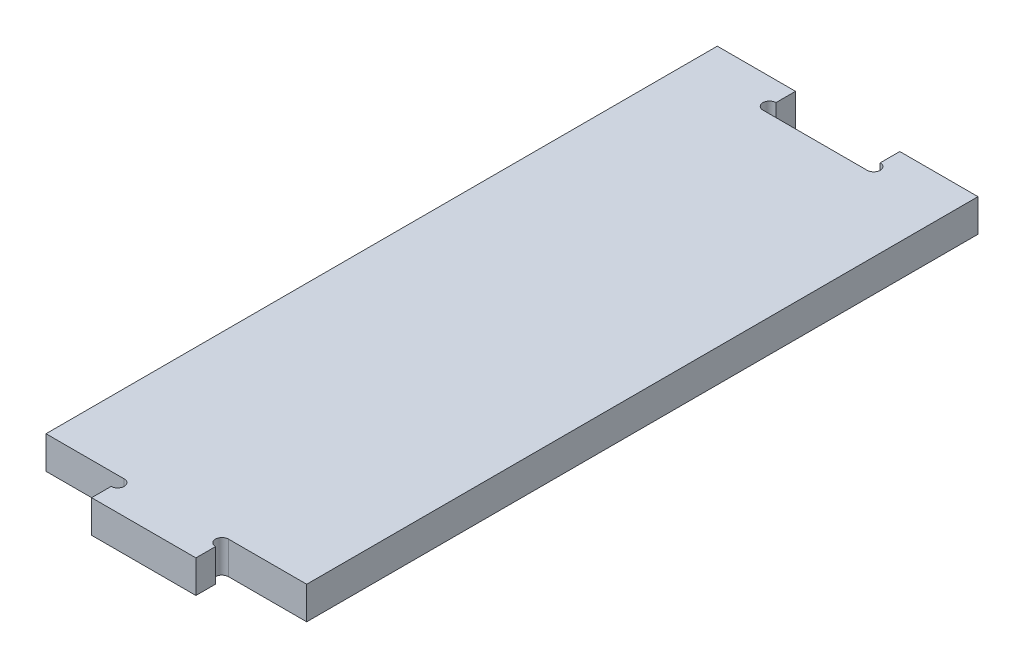
ISO-10303-21;
HEADER;
FILE_DESCRIPTION(('STEP AP214'),'2;1');
FILE_NAME('part.step','',(''),(''),'','','');
FILE_SCHEMA(('AUTOMOTIVE_DESIGN { 1 0 10303 214 1 1 1 1 }'));
ENDSEC;
DATA;
#1=APPLICATION_CONTEXT('core data for automotive mechanical design processes');
#2=APPLICATION_PROTOCOL_DEFINITION('international standard','automotive_design',2000,#1);
#3=PRODUCT_CONTEXT('',#1,'mechanical');
#4=PRODUCT('Part','Part','',(#3));
#5=PRODUCT_RELATED_PRODUCT_CATEGORY('part','',(#4));
#6=PRODUCT_DEFINITION_FORMATION('','',#4);
#7=PRODUCT_DEFINITION_CONTEXT('part definition',#1,'design');
#8=PRODUCT_DEFINITION('design','',#6,#7);
#9=PRODUCT_DEFINITION_SHAPE('','',#8);
#10=(LENGTH_UNIT() NAMED_UNIT(*) SI_UNIT(.MILLI.,.METRE.));
#11=(NAMED_UNIT(*) PLANE_ANGLE_UNIT() SI_UNIT($,.RADIAN.));
#12=(NAMED_UNIT(*) SI_UNIT($,.STERADIAN.) SOLID_ANGLE_UNIT());
#13=UNCERTAINTY_MEASURE_WITH_UNIT(LENGTH_MEASURE(1.E-05),#10,'distance_accuracy_value','');
#14=(GEOMETRIC_REPRESENTATION_CONTEXT(3) GLOBAL_UNCERTAINTY_ASSIGNED_CONTEXT((#13)) GLOBAL_UNIT_ASSIGNED_CONTEXT((#10,
#11,#12)) REPRESENTATION_CONTEXT('',''));
#15=CARTESIAN_POINT('',(0.,0.,0.));
#16=DIRECTION('',(0.,0.,1.));
#17=DIRECTION('',(1.,0.,0.));
#18=AXIS2_PLACEMENT_3D('',#15,#16,#17);
#19=CARTESIAN_POINT('',(0.,5.,0.));
#20=DIRECTION('',(0.,0.,-1.));
#21=DIRECTION('',(-1.,0.,0.));
#22=AXIS2_PLACEMENT_3D('',#19,#20,#21);
#23=PLANE('',#22);
#24=DIRECTION('',(0.,1.,0.));
#25=VECTOR('',#24,1.);
#26=CARTESIAN_POINT('',(28.,0.,0.));
#27=LINE('',#26,#25);
#28=CARTESIAN_POINT('',(28.,0.,0.));
#29=VERTEX_POINT('',#28);
#30=CARTESIAN_POINT('',(28.,5.,0.));
#31=VERTEX_POINT('',#30);
#32=EDGE_CURVE('E245',#29,#31,#27,.T.);
#33=ORIENTED_EDGE('',*,*,#32,.F.);
#34=DIRECTION('',(1.,0.,0.));
#35=VECTOR('',#34,1.);
#36=CARTESIAN_POINT('',(0.,0.,0.));
#37=LINE('',#36,#35);
#38=CARTESIAN_POINT('',(40.,0.,0.));
#39=VERTEX_POINT('',#38);
#40=EDGE_CURVE('E203',#29,#39,#37,.T.);
#41=ORIENTED_EDGE('',*,*,#40,.T.);
#42=DIRECTION('',(0.,-1.,0.));
#43=VECTOR('',#42,1.);
#44=CARTESIAN_POINT('',(40.,5.,0.));
#45=LINE('',#44,#43);
#46=CARTESIAN_POINT('',(40.,5.,0.));
#47=VERTEX_POINT('',#46);
#48=EDGE_CURVE('E224',#47,#39,#45,.T.);
#49=ORIENTED_EDGE('',*,*,#48,.F.);
#50=DIRECTION('',(1.,0.,0.));
#51=VECTOR('',#50,1.);
#52=CARTESIAN_POINT('',(0.,5.,0.));
#53=LINE('',#52,#51);
#54=EDGE_CURVE('E190',#31,#47,#53,.T.);
#55=ORIENTED_EDGE('',*,*,#54,.F.);
#56=EDGE_LOOP('',(#33,#41,#49,#55));
#57=FACE_BOUND('',#56,.T.);
#58=ADVANCED_FACE('F35',(#57),#23,.F.);
#59=CARTESIAN_POINT('',(0.,5.,-103.));
#60=DIRECTION('',(0.,0.,1.));
#61=DIRECTION('',(1.,0.,0.));
#62=AXIS2_PLACEMENT_3D('',#59,#60,#61);
#63=PLANE('',#62);
#64=DIRECTION('',(-1.,0.,0.));
#65=VECTOR('',#64,1.);
#66=CARTESIAN_POINT('',(0.,5.,-103.));
#67=LINE('',#66,#65);
#68=CARTESIAN_POINT('',(12.,5.,-103.));
#69=VERTEX_POINT('',#68);
#70=CARTESIAN_POINT('',(0.,5.,-103.));
#71=VERTEX_POINT('',#70);
#72=EDGE_CURVE('E328',#69,#71,#67,.T.);
#73=ORIENTED_EDGE('',*,*,#72,.F.);
#74=DIRECTION('',(0.,1.,0.));
#75=VECTOR('',#74,1.);
#76=CARTESIAN_POINT('',(12.,0.,-103.));
#77=LINE('',#76,#75);
#78=CARTESIAN_POINT('',(12.,0.,-103.));
#79=VERTEX_POINT('',#78);
#80=EDGE_CURVE('E180',#79,#69,#77,.T.);
#81=ORIENTED_EDGE('',*,*,#80,.F.);
#82=DIRECTION('',(-1.,0.,0.));
#83=VECTOR('',#82,1.);
#84=CARTESIAN_POINT('',(0.,0.,-103.));
#85=LINE('',#84,#83);
#86=CARTESIAN_POINT('',(0.,0.,-103.));
#87=VERTEX_POINT('',#86);
#88=EDGE_CURVE('E214',#79,#87,#85,.T.);
#89=ORIENTED_EDGE('',*,*,#88,.T.);
#90=DIRECTION('',(0.,-1.,0.));
#91=VECTOR('',#90,1.);
#92=CARTESIAN_POINT('',(0.,5.,-103.));
#93=LINE('',#92,#91);
#94=EDGE_CURVE('E217',#71,#87,#93,.T.);
#95=ORIENTED_EDGE('',*,*,#94,.F.);
#96=EDGE_LOOP('',(#73,#81,#89,#95));
#97=FACE_BOUND('',#96,.T.);
#98=ADVANCED_FACE('F335',(#97),#63,.F.);
#99=CARTESIAN_POINT('',(0.,5.,0.));
#100=DIRECTION('',(1.,0.,0.));
#101=DIRECTION('',(0.,0.,-1.));
#102=AXIS2_PLACEMENT_3D('',#99,#100,#101);
#103=PLANE('',#102);
#104=DIRECTION('',(0.,0.,1.));
#105=VECTOR('',#104,1.);
#106=CARTESIAN_POINT('',(0.,0.,0.));
#107=LINE('',#106,#105);
#108=CARTESIAN_POINT('',(0.,0.,0.));
#109=VERTEX_POINT('',#108);
#110=EDGE_CURVE('E182',#87,#109,#107,.T.);
#111=ORIENTED_EDGE('',*,*,#110,.T.);
#112=DIRECTION('',(0.,-1.,0.));
#113=VECTOR('',#112,1.);
#114=CARTESIAN_POINT('',(0.,5.,0.));
#115=LINE('',#114,#113);
#116=CARTESIAN_POINT('',(0.,5.,0.));
#117=VERTEX_POINT('',#116);
#118=EDGE_CURVE('E226',#117,#109,#115,.T.);
#119=ORIENTED_EDGE('',*,*,#118,.F.);
#120=DIRECTION('',(0.,0.,1.));
#121=VECTOR('',#120,1.);
#122=CARTESIAN_POINT('',(0.,5.,0.));
#123=LINE('',#122,#121);
#124=EDGE_CURVE('E187',#71,#117,#123,.T.);
#125=ORIENTED_EDGE('',*,*,#124,.F.);
#126=ORIENTED_EDGE('',*,*,#94,.T.);
#127=EDGE_LOOP('',(#111,#119,#125,#126));
#128=FACE_BOUND('',#127,.T.);
#129=ADVANCED_FACE('F37',(#128),#103,.F.);
#130=CARTESIAN_POINT('',(12.,0.,0.));
#131=VERTEX_POINT('',#130);
#132=EDGE_CURVE('E206',#109,#131,#37,.T.);
#133=ORIENTED_EDGE('',*,*,#132,.T.);
#134=DIRECTION('',(0.,1.,0.));
#135=VECTOR('',#134,1.);
#136=CARTESIAN_POINT('',(12.,0.,0.));
#137=LINE('',#136,#135);
#138=CARTESIAN_POINT('',(12.,5.,0.));
#139=VERTEX_POINT('',#138);
#140=EDGE_CURVE('E176',#131,#139,#137,.T.);
#141=ORIENTED_EDGE('',*,*,#140,.T.);
#142=EDGE_CURVE('E200',#117,#139,#53,.T.);
#143=ORIENTED_EDGE('',*,*,#142,.F.);
#144=ORIENTED_EDGE('',*,*,#118,.T.);
#145=EDGE_LOOP('',(#133,#141,#143,#144));
#146=FACE_BOUND('',#145,.T.);
#147=ADVANCED_FACE('F324',(#146),#23,.F.);
#148=CARTESIAN_POINT('',(40.,5.,0.));
#149=DIRECTION('',(-1.,0.,0.));
#150=DIRECTION('',(0.,0.,1.));
#151=AXIS2_PLACEMENT_3D('',#148,#149,#150);
#152=PLANE('',#151);
#153=DIRECTION('',(0.,0.,-1.));
#154=VECTOR('',#153,1.);
#155=CARTESIAN_POINT('',(40.,0.,0.));
#156=LINE('',#155,#154);
#157=CARTESIAN_POINT('',(40.,0.,-103.));
#158=VERTEX_POINT('',#157);
#159=EDGE_CURVE('E211',#39,#158,#156,.T.);
#160=ORIENTED_EDGE('',*,*,#159,.T.);
#161=DIRECTION('',(0.,-1.,0.));
#162=VECTOR('',#161,1.);
#163=CARTESIAN_POINT('',(40.,5.,-103.));
#164=LINE('',#163,#162);
#165=CARTESIAN_POINT('',(40.,5.,-103.));
#166=VERTEX_POINT('',#165);
#167=EDGE_CURVE('E220',#166,#158,#164,.T.);
#168=ORIENTED_EDGE('',*,*,#167,.F.);
#169=DIRECTION('',(0.,0.,-1.));
#170=VECTOR('',#169,1.);
#171=CARTESIAN_POINT('',(40.,5.,0.));
#172=LINE('',#171,#170);
#173=EDGE_CURVE('E194',#47,#166,#172,.T.);
#174=ORIENTED_EDGE('',*,*,#173,.F.);
#175=ORIENTED_EDGE('',*,*,#48,.T.);
#176=EDGE_LOOP('',(#160,#168,#174,#175));
#177=FACE_BOUND('',#176,.T.);
#178=ADVANCED_FACE('F276',(#177),#152,.F.);
#179=CARTESIAN_POINT('',(28.,0.,-103.));
#180=VERTEX_POINT('',#179);
#181=EDGE_CURVE('E191',#158,#180,#85,.T.);
#182=ORIENTED_EDGE('',*,*,#181,.T.);
#183=DIRECTION('',(0.,1.,0.));
#184=VECTOR('',#183,1.);
#185=CARTESIAN_POINT('',(28.,0.,-103.));
#186=LINE('',#185,#184);
#187=CARTESIAN_POINT('',(28.,5.,-103.));
#188=VERTEX_POINT('',#187);
#189=EDGE_CURVE('E157',#180,#188,#186,.T.);
#190=ORIENTED_EDGE('',*,*,#189,.T.);
#191=EDGE_CURVE('E221',#166,#188,#67,.T.);
#192=ORIENTED_EDGE('',*,*,#191,.F.);
#193=ORIENTED_EDGE('',*,*,#167,.T.);
#194=EDGE_LOOP('',(#182,#190,#192,#193));
#195=FACE_BOUND('',#194,.T.);
#196=ADVANCED_FACE('F272',(#195),#63,.F.);
#197=CARTESIAN_POINT('',(0.,5.,0.));
#198=DIRECTION('',(0.,-1.,0.));
#199=DIRECTION('',(0.,0.,-1.));
#200=AXIS2_PLACEMENT_3D('',#197,#198,#199);
#201=PLANE('',#200);
#202=DIRECTION('',(0.,0.,-1.));
#203=VECTOR('',#202,1.);
#204=CARTESIAN_POINT('',(28.,5.,-103.));
#205=LINE('',#204,#203);
#206=CARTESIAN_POINT('',(28.,5.,-100.));
#207=VERTEX_POINT('',#206);
#208=EDGE_CURVE('E167',#207,#188,#205,.T.);
#209=ORIENTED_EDGE('',*,*,#208,.F.);
#210=CARTESIAN_POINT('',(28.,5.,-99.));
#211=DIRECTION('',(0.,1.,0.));
#212=DIRECTION('',(0.,0.,1.));
#213=AXIS2_PLACEMENT_3D('',#210,#211,#212);
#214=CIRCLE('',#213,1.);
#215=CARTESIAN_POINT('',(28.,5.,-98.));
#216=VERTEX_POINT('',#215);
#217=EDGE_CURVE('E149',#216,#207,#214,.T.);
#218=ORIENTED_EDGE('',*,*,#217,.F.);
#219=DIRECTION('',(1.,0.,0.));
#220=VECTOR('',#219,1.);
#221=CARTESIAN_POINT('',(12.,5.,-98.));
#222=LINE('',#221,#220);
#223=CARTESIAN_POINT('',(12.,5.,-98.));
#224=VERTEX_POINT('',#223);
#225=EDGE_CURVE('E165',#224,#216,#222,.T.);
#226=ORIENTED_EDGE('',*,*,#225,.F.);
#227=CARTESIAN_POINT('',(12.,5.,-99.));
#228=DIRECTION('',(0.,1.,0.));
#229=DIRECTION('',(0.,0.,1.));
#230=AXIS2_PLACEMENT_3D('',#227,#228,#229);
#231=CIRCLE('',#230,1.);
#232=CARTESIAN_POINT('',(12.,5.,-100.));
#233=VERTEX_POINT('',#232);
#234=EDGE_CURVE('E338',#233,#224,#231,.T.);
#235=ORIENTED_EDGE('',*,*,#234,.F.);
#236=DIRECTION('',(0.,0.,1.));
#237=VECTOR('',#236,1.);
#238=CARTESIAN_POINT('',(12.,5.,-103.));
#239=LINE('',#238,#237);
#240=EDGE_CURVE('E171',#69,#233,#239,.T.);
#241=ORIENTED_EDGE('',*,*,#240,.F.);
#242=ORIENTED_EDGE('',*,*,#72,.T.);
#243=ORIENTED_EDGE('',*,*,#124,.T.);
#244=ORIENTED_EDGE('',*,*,#142,.T.);
#245=CARTESIAN_POINT('',(12.,5.,1.));
#246=DIRECTION('',(0.,1.,0.));
#247=DIRECTION('',(0.,0.,1.));
#248=AXIS2_PLACEMENT_3D('',#245,#246,#247);
#249=CIRCLE('',#248,1.);
#250=CARTESIAN_POINT('',(12.,5.,2.));
#251=VERTEX_POINT('',#250);
#252=EDGE_CURVE('E57',#251,#139,#249,.T.);
#253=ORIENTED_EDGE('',*,*,#252,.F.);
#254=DIRECTION('',(0.,0.,1.));
#255=VECTOR('',#254,1.);
#256=CARTESIAN_POINT('',(12.,5.,0.));
#257=LINE('',#256,#255);
#258=CARTESIAN_POINT('',(12.,5.,5.));
#259=VERTEX_POINT('',#258);
#260=EDGE_CURVE('E239',#251,#259,#257,.T.);
#261=ORIENTED_EDGE('',*,*,#260,.T.);
#262=DIRECTION('',(1.,0.,0.));
#263=VECTOR('',#262,1.);
#264=CARTESIAN_POINT('',(12.,5.,5.));
#265=LINE('',#264,#263);
#266=CARTESIAN_POINT('',(28.,5.,5.));
#267=VERTEX_POINT('',#266);
#268=EDGE_CURVE('E309',#259,#267,#265,.T.);
#269=ORIENTED_EDGE('',*,*,#268,.T.);
#270=DIRECTION('',(0.,0.,-1.));
#271=VECTOR('',#270,1.);
#272=CARTESIAN_POINT('',(28.,5.,0.));
#273=LINE('',#272,#271);
#274=CARTESIAN_POINT('',(28.,5.,2.));
#275=VERTEX_POINT('',#274);
#276=EDGE_CURVE('E238',#267,#275,#273,.T.);
#277=ORIENTED_EDGE('',*,*,#276,.T.);
#278=CARTESIAN_POINT('',(28.,5.,1.));
#279=DIRECTION('',(0.,1.,0.));
#280=DIRECTION('',(0.,0.,1.));
#281=AXIS2_PLACEMENT_3D('',#278,#279,#280);
#282=CIRCLE('',#281,1.);
#283=EDGE_CURVE('E49',#31,#275,#282,.T.);
#284=ORIENTED_EDGE('',*,*,#283,.F.);
#285=ORIENTED_EDGE('',*,*,#54,.T.);
#286=ORIENTED_EDGE('',*,*,#173,.T.);
#287=ORIENTED_EDGE('',*,*,#191,.T.);
#288=EDGE_LOOP('',(#209,#218,#226,#235,#241,#242,#243,#244,#253,#261,#269,#277,#284,#285,#286,#287));
#289=FACE_BOUND('',#288,.T.);
#290=ADVANCED_FACE('F163',(#289),#201,.F.);
#291=CARTESIAN_POINT('',(0.,0.,0.));
#292=DIRECTION('',(0.,-1.,0.));
#293=DIRECTION('',(0.,0.,-1.));
#294=AXIS2_PLACEMENT_3D('',#291,#292,#293);
#295=PLANE('',#294);
#296=CARTESIAN_POINT('',(28.,0.,-99.));
#297=DIRECTION('',(0.,-1.,0.));
#298=DIRECTION('',(0.,0.,-1.));
#299=AXIS2_PLACEMENT_3D('',#296,#297,#298);
#300=CIRCLE('',#299,1.);
#301=CARTESIAN_POINT('',(28.,0.,-100.));
#302=VERTEX_POINT('',#301);
#303=CARTESIAN_POINT('',(28.,0.,-98.));
#304=VERTEX_POINT('',#303);
#305=EDGE_CURVE('E152',#302,#304,#300,.T.);
#306=ORIENTED_EDGE('',*,*,#305,.F.);
#307=DIRECTION('',(0.,0.,-1.));
#308=VECTOR('',#307,1.);
#309=CARTESIAN_POINT('',(28.,0.,-103.));
#310=LINE('',#309,#308);
#311=EDGE_CURVE('E186',#302,#180,#310,.T.);
#312=ORIENTED_EDGE('',*,*,#311,.T.);
#313=ORIENTED_EDGE('',*,*,#181,.F.);
#314=ORIENTED_EDGE('',*,*,#159,.F.);
#315=ORIENTED_EDGE('',*,*,#40,.F.);
#316=CARTESIAN_POINT('',(28.,0.,1.));
#317=DIRECTION('',(0.,-1.,0.));
#318=DIRECTION('',(0.,0.,-1.));
#319=AXIS2_PLACEMENT_3D('',#316,#317,#318);
#320=CIRCLE('',#319,1.);
#321=CARTESIAN_POINT('',(28.,0.,2.));
#322=VERTEX_POINT('',#321);
#323=EDGE_CURVE('E281',#322,#29,#320,.T.);
#324=ORIENTED_EDGE('',*,*,#323,.F.);
#325=DIRECTION('',(0.,0.,-1.));
#326=VECTOR('',#325,1.);
#327=CARTESIAN_POINT('',(28.,0.,0.));
#328=LINE('',#327,#326);
#329=CARTESIAN_POINT('',(28.,0.,5.));
#330=VERTEX_POINT('',#329);
#331=EDGE_CURVE('E249',#330,#322,#328,.T.);
#332=ORIENTED_EDGE('',*,*,#331,.F.);
#333=DIRECTION('',(1.,0.,0.));
#334=VECTOR('',#333,1.);
#335=CARTESIAN_POINT('',(12.,0.,5.));
#336=LINE('',#335,#334);
#337=CARTESIAN_POINT('',(12.,0.,5.));
#338=VERTEX_POINT('',#337);
#339=EDGE_CURVE('E237',#338,#330,#336,.T.);
#340=ORIENTED_EDGE('',*,*,#339,.F.);
#341=DIRECTION('',(0.,0.,1.));
#342=VECTOR('',#341,1.);
#343=CARTESIAN_POINT('',(12.,0.,0.));
#344=LINE('',#343,#342);
#345=CARTESIAN_POINT('',(12.,0.,2.));
#346=VERTEX_POINT('',#345);
#347=EDGE_CURVE('E234',#346,#338,#344,.T.);
#348=ORIENTED_EDGE('',*,*,#347,.F.);
#349=CARTESIAN_POINT('',(12.,0.,1.));
#350=DIRECTION('',(0.,-1.,0.));
#351=DIRECTION('',(0.,0.,-1.));
#352=AXIS2_PLACEMENT_3D('',#349,#350,#351);
#353=CIRCLE('',#352,1.);
#354=EDGE_CURVE('E304',#131,#346,#353,.T.);
#355=ORIENTED_EDGE('',*,*,#354,.F.);
#356=ORIENTED_EDGE('',*,*,#132,.F.);
#357=ORIENTED_EDGE('',*,*,#110,.F.);
#358=ORIENTED_EDGE('',*,*,#88,.F.);
#359=DIRECTION('',(0.,0.,1.));
#360=VECTOR('',#359,1.);
#361=CARTESIAN_POINT('',(12.,0.,-103.));
#362=LINE('',#361,#360);
#363=CARTESIAN_POINT('',(12.,0.,-100.));
#364=VERTEX_POINT('',#363);
#365=EDGE_CURVE('E173',#79,#364,#362,.T.);
#366=ORIENTED_EDGE('',*,*,#365,.T.);
#367=CARTESIAN_POINT('',(12.,0.,-99.));
#368=DIRECTION('',(0.,-1.,0.));
#369=DIRECTION('',(0.,0.,-1.));
#370=AXIS2_PLACEMENT_3D('',#367,#368,#369);
#371=CIRCLE('',#370,1.);
#372=CARTESIAN_POINT('',(12.,0.,-98.));
#373=VERTEX_POINT('',#372);
#374=EDGE_CURVE('E294',#373,#364,#371,.T.);
#375=ORIENTED_EDGE('',*,*,#374,.F.);
#376=DIRECTION('',(1.,0.,0.));
#377=VECTOR('',#376,1.);
#378=CARTESIAN_POINT('',(12.,0.,-98.));
#379=LINE('',#378,#377);
#380=EDGE_CURVE('E261',#373,#304,#379,.T.);
#381=ORIENTED_EDGE('',*,*,#380,.T.);
#382=EDGE_LOOP('',(#306,#312,#313,#314,#315,#324,#332,#340,#348,#355,#356,#357,#358,#366,#375,#381));
#383=FACE_BOUND('',#382,.T.);
#384=ADVANCED_FACE('F266',(#383),#295,.T.);
#385=CARTESIAN_POINT('',(12.,0.,-103.));
#386=DIRECTION('',(-1.,0.,0.));
#387=DIRECTION('',(0.,0.,1.));
#388=AXIS2_PLACEMENT_3D('',#385,#386,#387);
#389=PLANE('',#388);
#390=ORIENTED_EDGE('',*,*,#240,.T.);
#391=DIRECTION('',(0.,1.,0.));
#392=VECTOR('',#391,1.);
#393=CARTESIAN_POINT('',(12.,-5.,-100.));
#394=LINE('',#393,#392);
#395=EDGE_CURVE('E290',#233,#364,#394,.F.);
#396=ORIENTED_EDGE('',*,*,#395,.T.);
#397=ORIENTED_EDGE('',*,*,#365,.F.);
#398=ORIENTED_EDGE('',*,*,#80,.T.);
#399=EDGE_LOOP('',(#390,#396,#397,#398));
#400=FACE_BOUND('',#399,.T.);
#401=ADVANCED_FACE('F337',(#400),#389,.F.);
#402=CARTESIAN_POINT('',(28.,0.,-103.));
#403=DIRECTION('',(1.,0.,0.));
#404=DIRECTION('',(0.,0.,-1.));
#405=AXIS2_PLACEMENT_3D('',#402,#403,#404);
#406=PLANE('',#405);
#407=ORIENTED_EDGE('',*,*,#311,.F.);
#408=DIRECTION('',(0.,1.,0.));
#409=VECTOR('',#408,1.);
#410=CARTESIAN_POINT('',(28.,-5.,-100.));
#411=LINE('',#410,#409);
#412=EDGE_CURVE('E340',#302,#207,#411,.T.);
#413=ORIENTED_EDGE('',*,*,#412,.T.);
#414=ORIENTED_EDGE('',*,*,#208,.T.);
#415=ORIENTED_EDGE('',*,*,#189,.F.);
#416=EDGE_LOOP('',(#407,#413,#414,#415));
#417=FACE_BOUND('',#416,.T.);
#418=ADVANCED_FACE('F269',(#417),#406,.F.);
#419=CARTESIAN_POINT('',(12.,0.,-98.));
#420=DIRECTION('',(0.,0.,1.));
#421=DIRECTION('',(1.,0.,0.));
#422=AXIS2_PLACEMENT_3D('',#419,#420,#421);
#423=PLANE('',#422);
#424=ORIENTED_EDGE('',*,*,#225,.T.);
#425=DIRECTION('',(0.,1.,0.));
#426=VECTOR('',#425,1.);
#427=CARTESIAN_POINT('',(28.,0.,-98.));
#428=LINE('',#427,#426);
#429=EDGE_CURVE('E146',#304,#216,#428,.T.);
#430=ORIENTED_EDGE('',*,*,#429,.F.);
#431=ORIENTED_EDGE('',*,*,#380,.F.);
#432=DIRECTION('',(0.,1.,0.));
#433=VECTOR('',#432,1.);
#434=CARTESIAN_POINT('',(12.,0.,-98.));
#435=LINE('',#434,#433);
#436=EDGE_CURVE('E158',#373,#224,#435,.T.);
#437=ORIENTED_EDGE('',*,*,#436,.T.);
#438=EDGE_LOOP('',(#424,#430,#431,#437));
#439=FACE_BOUND('',#438,.T.);
#440=ADVANCED_FACE('F170',(#439),#423,.F.);
#441=CARTESIAN_POINT('',(12.,0.,0.));
#442=DIRECTION('',(-1.,0.,0.));
#443=DIRECTION('',(0.,0.,1.));
#444=AXIS2_PLACEMENT_3D('',#441,#442,#443);
#445=PLANE('',#444);
#446=DIRECTION('',(0.,1.,0.));
#447=VECTOR('',#446,1.);
#448=CARTESIAN_POINT('',(12.,-5.,2.));
#449=LINE('',#448,#447);
#450=EDGE_CURVE('E43',#346,#251,#449,.T.);
#451=ORIENTED_EDGE('',*,*,#450,.F.);
#452=ORIENTED_EDGE('',*,*,#347,.T.);
#453=DIRECTION('',(0.,1.,0.));
#454=VECTOR('',#453,1.);
#455=CARTESIAN_POINT('',(12.,0.,5.));
#456=LINE('',#455,#454);
#457=EDGE_CURVE('E256',#338,#259,#456,.T.);
#458=ORIENTED_EDGE('',*,*,#457,.T.);
#459=ORIENTED_EDGE('',*,*,#260,.F.);
#460=EDGE_LOOP('',(#451,#452,#458,#459));
#461=FACE_BOUND('',#460,.T.);
#462=ADVANCED_FACE('F315',(#461),#445,.T.);
#463=CARTESIAN_POINT('',(28.,0.,0.));
#464=DIRECTION('',(1.,0.,0.));
#465=DIRECTION('',(0.,0.,-1.));
#466=AXIS2_PLACEMENT_3D('',#463,#464,#465);
#467=PLANE('',#466);
#468=DIRECTION('',(0.,1.,0.));
#469=VECTOR('',#468,1.);
#470=CARTESIAN_POINT('',(28.,-5.,2.));
#471=LINE('',#470,#469);
#472=EDGE_CURVE('E11',#275,#322,#471,.F.);
#473=ORIENTED_EDGE('',*,*,#472,.F.);
#474=ORIENTED_EDGE('',*,*,#276,.F.);
#475=DIRECTION('',(0.,1.,0.));
#476=VECTOR('',#475,1.);
#477=CARTESIAN_POINT('',(28.,0.,5.));
#478=LINE('',#477,#476);
#479=EDGE_CURVE('E248',#330,#267,#478,.T.);
#480=ORIENTED_EDGE('',*,*,#479,.F.);
#481=ORIENTED_EDGE('',*,*,#331,.T.);
#482=EDGE_LOOP('',(#473,#474,#480,#481));
#483=FACE_BOUND('',#482,.T.);
#484=ADVANCED_FACE('F321',(#483),#467,.T.);
#485=CARTESIAN_POINT('',(12.,0.,5.));
#486=DIRECTION('',(0.,0.,1.));
#487=DIRECTION('',(1.,0.,0.));
#488=AXIS2_PLACEMENT_3D('',#485,#486,#487);
#489=PLANE('',#488);
#490=ORIENTED_EDGE('',*,*,#268,.F.);
#491=ORIENTED_EDGE('',*,*,#457,.F.);
#492=ORIENTED_EDGE('',*,*,#339,.T.);
#493=ORIENTED_EDGE('',*,*,#479,.T.);
#494=EDGE_LOOP('',(#490,#491,#492,#493));
#495=FACE_BOUND('',#494,.T.);
#496=ADVANCED_FACE('F319',(#495),#489,.T.);
#497=CARTESIAN_POINT('',(12.,-5.,1.));
#498=DIRECTION('',(0.,1.,0.));
#499=DIRECTION('',(0.,0.,1.));
#500=AXIS2_PLACEMENT_3D('',#497,#498,#499);
#501=CYLINDRICAL_SURFACE('',#500,1.);
#502=ORIENTED_EDGE('',*,*,#450,.T.);
#503=ORIENTED_EDGE('',*,*,#252,.T.);
#504=ORIENTED_EDGE('',*,*,#140,.F.);
#505=ORIENTED_EDGE('',*,*,#354,.T.);
#506=EDGE_LOOP('',(#502,#503,#504,#505));
#507=FACE_BOUND('',#506,.T.);
#508=ADVANCED_FACE('F353',(#507),#501,.F.);
#509=CARTESIAN_POINT('',(28.,-5.,1.));
#510=DIRECTION('',(0.,1.,0.));
#511=DIRECTION('',(0.,0.,1.));
#512=AXIS2_PLACEMENT_3D('',#509,#510,#511);
#513=CYLINDRICAL_SURFACE('',#512,1.);
#514=ORIENTED_EDGE('',*,*,#32,.T.);
#515=ORIENTED_EDGE('',*,*,#283,.T.);
#516=ORIENTED_EDGE('',*,*,#472,.T.);
#517=ORIENTED_EDGE('',*,*,#323,.T.);
#518=EDGE_LOOP('',(#514,#515,#516,#517));
#519=FACE_BOUND('',#518,.T.);
#520=ADVANCED_FACE('F286',(#519),#513,.F.);
#521=CARTESIAN_POINT('',(12.,-5.,-99.));
#522=DIRECTION('',(0.,1.,0.));
#523=DIRECTION('',(0.,0.,1.));
#524=AXIS2_PLACEMENT_3D('',#521,#522,#523);
#525=CYLINDRICAL_SURFACE('',#524,1.);
#526=ORIENTED_EDGE('',*,*,#234,.T.);
#527=ORIENTED_EDGE('',*,*,#436,.F.);
#528=ORIENTED_EDGE('',*,*,#374,.T.);
#529=ORIENTED_EDGE('',*,*,#395,.F.);
#530=EDGE_LOOP('',(#526,#527,#528,#529));
#531=FACE_BOUND('',#530,.T.);
#532=ADVANCED_FACE('F345',(#531),#525,.F.);
#533=CARTESIAN_POINT('',(28.,-5.,-99.));
#534=DIRECTION('',(0.,1.,0.));
#535=DIRECTION('',(0.,0.,1.));
#536=AXIS2_PLACEMENT_3D('',#533,#534,#535);
#537=CYLINDRICAL_SURFACE('',#536,1.);
#538=ORIENTED_EDGE('',*,*,#305,.T.);
#539=ORIENTED_EDGE('',*,*,#429,.T.);
#540=ORIENTED_EDGE('',*,*,#217,.T.);
#541=ORIENTED_EDGE('',*,*,#412,.F.);
#542=EDGE_LOOP('',(#538,#539,#540,#541));
#543=FACE_BOUND('',#542,.T.);
#544=ADVANCED_FACE('F148',(#543),#537,.F.);
#545=CLOSED_SHELL('',(#58,#98,#129,#147,#178,#196,#290,#384,#401,#418,#440,#462,#484,#496,#508,
#520,#532,#544));
#546=MANIFOLD_SOLID_BREP('B2',#545);
#547=ADVANCED_BREP_SHAPE_REPRESENTATION('',(#18,#546),#14);
#548=SHAPE_DEFINITION_REPRESENTATION(#9,#547);
ENDSEC;
END-ISO-10303-21;
